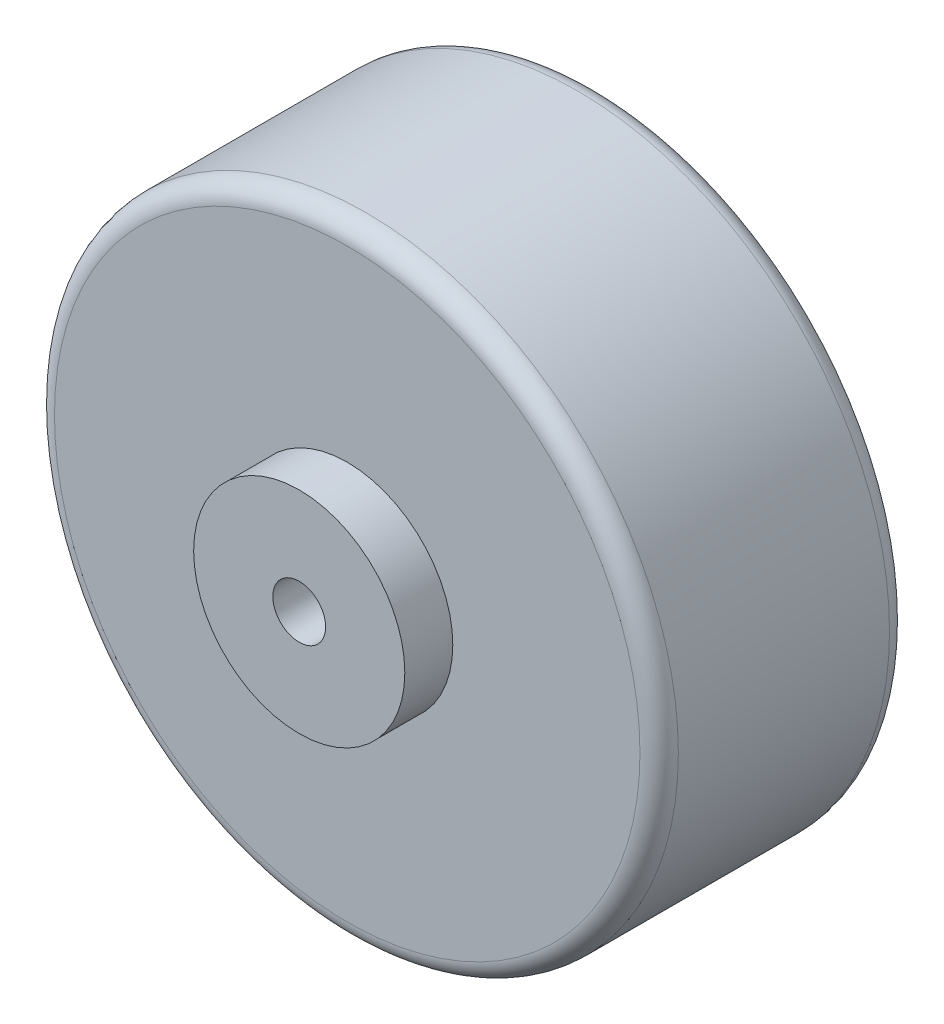
ISO-10303-21;
HEADER;
FILE_DESCRIPTION(('STEP AP214'),'2;1');
FILE_NAME('part.step','',(''),(''),'','','');
FILE_SCHEMA(('AUTOMOTIVE_DESIGN { 1 0 10303 214 1 1 1 1 }'));
ENDSEC;
DATA;
#1=APPLICATION_CONTEXT('core data for automotive mechanical design processes');
#2=APPLICATION_PROTOCOL_DEFINITION('international standard','automotive_design',2000,#1);
#3=PRODUCT_CONTEXT('',#1,'mechanical');
#4=PRODUCT('Part','Part','',(#3));
#5=PRODUCT_RELATED_PRODUCT_CATEGORY('part','',(#4));
#6=PRODUCT_DEFINITION_FORMATION('','',#4);
#7=PRODUCT_DEFINITION_CONTEXT('part definition',#1,'design');
#8=PRODUCT_DEFINITION('design','',#6,#7);
#9=PRODUCT_DEFINITION_SHAPE('','',#8);
#10=(LENGTH_UNIT() NAMED_UNIT(*) SI_UNIT(.MILLI.,.METRE.));
#11=(NAMED_UNIT(*) PLANE_ANGLE_UNIT() SI_UNIT($,.RADIAN.));
#12=(NAMED_UNIT(*) SI_UNIT($,.STERADIAN.) SOLID_ANGLE_UNIT());
#13=UNCERTAINTY_MEASURE_WITH_UNIT(LENGTH_MEASURE(1.E-05),#10,'distance_accuracy_value','');
#14=(GEOMETRIC_REPRESENTATION_CONTEXT(3) GLOBAL_UNCERTAINTY_ASSIGNED_CONTEXT((#13)) GLOBAL_UNIT_ASSIGNED_CONTEXT((#10,
#11,#12)) REPRESENTATION_CONTEXT('',''));
#15=CARTESIAN_POINT('',(0.,0.,0.));
#16=DIRECTION('',(0.,0.,1.));
#17=DIRECTION('',(1.,0.,0.));
#18=AXIS2_PLACEMENT_3D('',#15,#16,#17);
#19=CARTESIAN_POINT('',(0.,0.,26.));
#20=DIRECTION('',(0.,0.,1.));
#21=DIRECTION('',(1.,0.,0.));
#22=AXIS2_PLACEMENT_3D('',#19,#20,#21);
#23=PLANE('',#22);
#24=CARTESIAN_POINT('',(0.,0.,26.));
#25=DIRECTION('',(0.,0.,-1.));
#26=DIRECTION('',(-1.,0.,0.));
#27=AXIS2_PLACEMENT_3D('',#24,#25,#26);
#28=CIRCLE('',#27,11.);
#29=CARTESIAN_POINT('',(-11.,0.,26.));
#30=VERTEX_POINT('',#29);
#31=EDGE_CURVE('E53',#30,#30,#28,.F.);
#32=ORIENTED_EDGE('',*,*,#31,.F.);
#33=EDGE_LOOP('',(#32));
#34=FACE_BOUND('',#33,.T.);
#35=CARTESIAN_POINT('',(0.,0.,26.));
#36=DIRECTION('',(0.,0.,-1.));
#37=DIRECTION('',(-1.,0.,0.));
#38=AXIS2_PLACEMENT_3D('',#35,#36,#37);
#39=CIRCLE('',#38,30.5);
#40=CARTESIAN_POINT('',(-30.5,0.,26.));
#41=VERTEX_POINT('',#40);
#42=CARTESIAN_POINT('',(30.5,0.,26.));
#43=VERTEX_POINT('',#42);
#44=EDGE_CURVE('E43',#41,#43,#39,.T.);
#45=ORIENTED_EDGE('',*,*,#44,.F.);
#46=CARTESIAN_POINT('',(0.,0.,26.));
#47=DIRECTION('',(0.,0.,-1.));
#48=DIRECTION('',(1.,0.,0.));
#49=AXIS2_PLACEMENT_3D('',#46,#47,#48);
#50=CIRCLE('',#49,30.5);
#51=EDGE_CURVE('E47',#43,#41,#50,.T.);
#52=ORIENTED_EDGE('',*,*,#51,.F.);
#53=EDGE_LOOP('',(#45,#52));
#54=FACE_BOUND('',#53,.T.);
#55=ADVANCED_FACE('F16',(#34,#54),#23,.T.);
#56=CARTESIAN_POINT('',(0.,0.,24.));
#57=DIRECTION('',(0.,0.,1.));
#58=DIRECTION('',(1.,0.,0.));
#59=AXIS2_PLACEMENT_3D('',#56,#57,#58);
#60=TOROIDAL_SURFACE('',#59,30.5,2.);
#61=CARTESIAN_POINT('',(0.,0.,24.));
#62=DIRECTION('',(0.,0.,-1.));
#63=DIRECTION('',(-1.,0.,0.));
#64=AXIS2_PLACEMENT_3D('',#61,#62,#63);
#65=CIRCLE('',#64,32.5);
#66=CARTESIAN_POINT('',(-32.5,0.,24.));
#67=VERTEX_POINT('',#66);
#68=EDGE_CURVE('E75',#67,#67,#65,.T.);
#69=ORIENTED_EDGE('',*,*,#68,.F.);
#70=EDGE_LOOP('',(#69));
#71=FACE_BOUND('',#70,.T.);
#72=ORIENTED_EDGE('',*,*,#51,.T.);
#73=ORIENTED_EDGE('',*,*,#44,.T.);
#74=EDGE_LOOP('',(#72,#73));
#75=FACE_BOUND('',#74,.T.);
#76=ADVANCED_FACE('F52',(#71,#75),#60,.T.);
#77=CARTESIAN_POINT('',(0.,0.,31.));
#78=DIRECTION('',(0.,0.,-1.));
#79=DIRECTION('',(-1.,0.,0.));
#80=AXIS2_PLACEMENT_3D('',#77,#78,#79);
#81=CYLINDRICAL_SURFACE('',#80,11.);
#82=ORIENTED_EDGE('',*,*,#31,.T.);
#83=EDGE_LOOP('',(#82));
#84=FACE_BOUND('',#83,.T.);
#85=CARTESIAN_POINT('',(0.,0.,31.));
#86=DIRECTION('',(0.,0.,-1.));
#87=DIRECTION('',(-1.,0.,0.));
#88=AXIS2_PLACEMENT_3D('',#85,#86,#87);
#89=CIRCLE('',#88,11.);
#90=CARTESIAN_POINT('',(-11.,0.,31.));
#91=VERTEX_POINT('',#90);
#92=EDGE_CURVE('E78',#91,#91,#89,.F.);
#93=ORIENTED_EDGE('',*,*,#92,.F.);
#94=EDGE_LOOP('',(#93));
#95=FACE_BOUND('',#94,.T.);
#96=ADVANCED_FACE('F69',(#84,#95),#81,.T.);
#97=CARTESIAN_POINT('',(0.,0.,26.));
#98=DIRECTION('',(0.,0.,-1.));
#99=DIRECTION('',(-1.,0.,0.));
#100=AXIS2_PLACEMENT_3D('',#97,#98,#99);
#101=CYLINDRICAL_SURFACE('',#100,32.5);
#102=ORIENTED_EDGE('',*,*,#68,.T.);
#103=EDGE_LOOP('',(#102));
#104=FACE_BOUND('',#103,.T.);
#105=CARTESIAN_POINT('',(0.,0.,2.));
#106=DIRECTION('',(0.,0.,1.));
#107=DIRECTION('',(1.,0.,0.));
#108=AXIS2_PLACEMENT_3D('',#105,#106,#107);
#109=CIRCLE('',#108,32.5);
#110=CARTESIAN_POINT('',(32.5,0.,2.));
#111=VERTEX_POINT('',#110);
#112=EDGE_CURVE('E79',#111,#111,#109,.F.);
#113=ORIENTED_EDGE('',*,*,#112,.F.);
#114=EDGE_LOOP('',(#113));
#115=FACE_BOUND('',#114,.T.);
#116=ADVANCED_FACE('F131',(#104,#115),#101,.T.);
#117=CARTESIAN_POINT('',(0.,0.,31.));
#118=DIRECTION('',(0.,0.,1.));
#119=DIRECTION('',(1.,0.,0.));
#120=AXIS2_PLACEMENT_3D('',#117,#118,#119);
#121=PLANE('',#120);
#122=ORIENTED_EDGE('',*,*,#92,.T.);
#123=EDGE_LOOP('',(#122));
#124=FACE_BOUND('',#123,.T.);
#125=CARTESIAN_POINT('',(0.,0.,31.));
#126=DIRECTION('',(0.,0.,1.));
#127=DIRECTION('',(1.,0.,0.));
#128=AXIS2_PLACEMENT_3D('',#125,#126,#127);
#129=CIRCLE('',#128,2.75);
#130=CARTESIAN_POINT('',(2.75,0.,31.));
#131=VERTEX_POINT('',#130);
#132=EDGE_CURVE('E82',#131,#131,#129,.F.);
#133=ORIENTED_EDGE('',*,*,#132,.T.);
#134=EDGE_LOOP('',(#133));
#135=FACE_BOUND('',#134,.T.);
#136=ADVANCED_FACE('F99',(#124,#135),#121,.T.);
#137=CARTESIAN_POINT('',(0.,0.,2.));
#138=DIRECTION('',(0.,0.,1.));
#139=DIRECTION('',(1.,0.,0.));
#140=AXIS2_PLACEMENT_3D('',#137,#138,#139);
#141=TOROIDAL_SURFACE('',#140,30.5,2.);
#142=CARTESIAN_POINT('',(0.,0.,0.));
#143=DIRECTION('',(0.,0.,1.));
#144=DIRECTION('',(1.,0.,0.));
#145=AXIS2_PLACEMENT_3D('',#142,#143,#144);
#146=CIRCLE('',#145,30.5);
#147=CARTESIAN_POINT('',(30.5,0.,0.));
#148=VERTEX_POINT('',#147);
#149=CARTESIAN_POINT('',(-30.5,0.,0.));
#150=VERTEX_POINT('',#149);
#151=EDGE_CURVE('E126',#148,#150,#146,.T.);
#152=ORIENTED_EDGE('',*,*,#151,.T.);
#153=CARTESIAN_POINT('',(0.,0.,0.));
#154=DIRECTION('',(0.,0.,1.));
#155=DIRECTION('',(-1.,0.,0.));
#156=AXIS2_PLACEMENT_3D('',#153,#154,#155);
#157=CIRCLE('',#156,30.5);
#158=EDGE_CURVE('E27',#150,#148,#157,.T.);
#159=ORIENTED_EDGE('',*,*,#158,.T.);
#160=EDGE_LOOP('',(#152,#159));
#161=FACE_BOUND('',#160,.T.);
#162=ORIENTED_EDGE('',*,*,#112,.T.);
#163=EDGE_LOOP('',(#162));
#164=FACE_BOUND('',#163,.T.);
#165=ADVANCED_FACE('F88',(#161,#164),#141,.T.);
#166=CARTESIAN_POINT('',(0.,0.,0.));
#167=DIRECTION('',(0.,0.,1.));
#168=DIRECTION('',(1.,0.,0.));
#169=AXIS2_PLACEMENT_3D('',#166,#167,#168);
#170=CYLINDRICAL_SURFACE('',#169,2.75);
#171=CARTESIAN_POINT('',(0.,0.,0.));
#172=DIRECTION('',(0.,0.,1.));
#173=DIRECTION('',(1.,0.,0.));
#174=AXIS2_PLACEMENT_3D('',#171,#172,#173);
#175=CIRCLE('',#174,2.75);
#176=CARTESIAN_POINT('',(2.75,0.,0.));
#177=VERTEX_POINT('',#176);
#178=EDGE_CURVE('E11',#177,#177,#175,.F.);
#179=ORIENTED_EDGE('',*,*,#178,.T.);
#180=EDGE_LOOP('',(#179));
#181=FACE_BOUND('',#180,.T.);
#182=ORIENTED_EDGE('',*,*,#132,.F.);
#183=EDGE_LOOP('',(#182));
#184=FACE_BOUND('',#183,.T.);
#185=ADVANCED_FACE('F98',(#181,#184),#170,.F.);
#186=CARTESIAN_POINT('',(0.,0.,0.));
#187=DIRECTION('',(0.,0.,1.));
#188=DIRECTION('',(1.,0.,0.));
#189=AXIS2_PLACEMENT_3D('',#186,#187,#188);
#190=PLANE('',#189);
#191=ORIENTED_EDGE('',*,*,#178,.F.);
#192=EDGE_LOOP('',(#191));
#193=FACE_BOUND('',#192,.T.);
#194=ORIENTED_EDGE('',*,*,#151,.F.);
#195=ORIENTED_EDGE('',*,*,#158,.F.);
#196=EDGE_LOOP('',(#194,#195));
#197=FACE_BOUND('',#196,.T.);
#198=ADVANCED_FACE('F108',(#193,#197),#190,.F.);
#199=CLOSED_SHELL('',(#55,#76,#96,#116,#136,#165,#185,#198));
#200=MANIFOLD_SOLID_BREP('B1',#199);
#201=ADVANCED_BREP_SHAPE_REPRESENTATION('',(#18,#200),#14);
#202=SHAPE_DEFINITION_REPRESENTATION(#9,#201);
ENDSEC;
END-ISO-10303-21;
